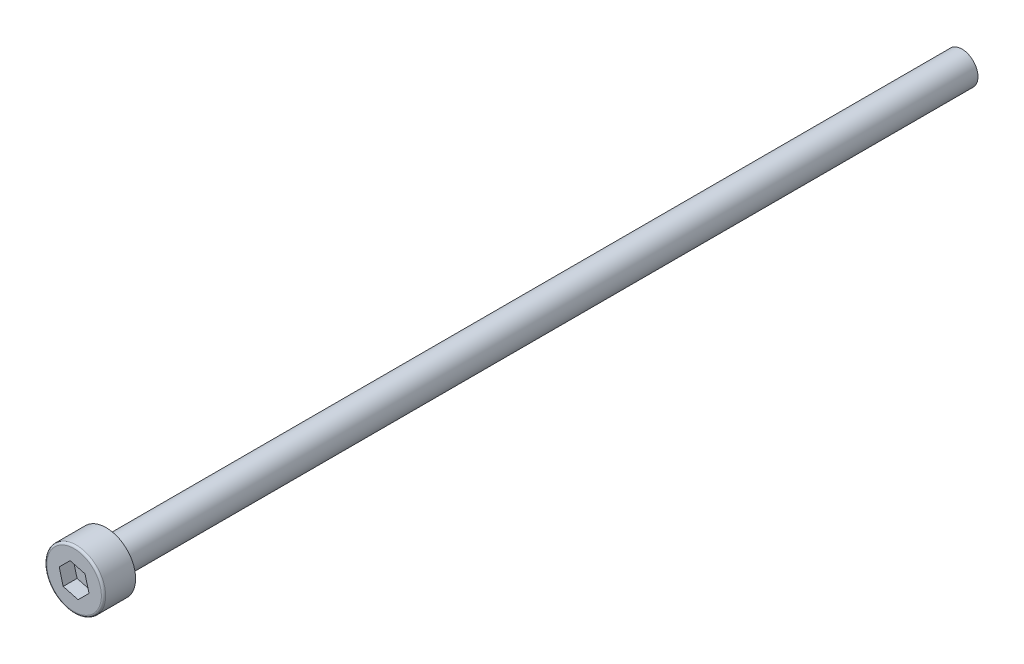
ISO-10303-21;
HEADER;
FILE_DESCRIPTION(('STEP AP214'),'2;1');
FILE_NAME('part.step','',(''),(''),'','','');
FILE_SCHEMA(('AUTOMOTIVE_DESIGN { 1 0 10303 214 1 1 1 1 }'));
ENDSEC;
DATA;
#1=APPLICATION_CONTEXT('core data for automotive mechanical design processes');
#2=APPLICATION_PROTOCOL_DEFINITION('international standard','automotive_design',2000,#1);
#3=PRODUCT_CONTEXT('',#1,'mechanical');
#4=PRODUCT('Part','Part','',(#3));
#5=PRODUCT_RELATED_PRODUCT_CATEGORY('part','',(#4));
#6=PRODUCT_DEFINITION_FORMATION('','',#4);
#7=PRODUCT_DEFINITION_CONTEXT('part definition',#1,'design');
#8=PRODUCT_DEFINITION('design','',#6,#7);
#9=PRODUCT_DEFINITION_SHAPE('','',#8);
#10=(LENGTH_UNIT() NAMED_UNIT(*) SI_UNIT(.MILLI.,.METRE.));
#11=(NAMED_UNIT(*) PLANE_ANGLE_UNIT() SI_UNIT($,.RADIAN.));
#12=(NAMED_UNIT(*) SI_UNIT($,.STERADIAN.) SOLID_ANGLE_UNIT());
#13=UNCERTAINTY_MEASURE_WITH_UNIT(LENGTH_MEASURE(1.E-05),#10,'distance_accuracy_value','');
#14=(GEOMETRIC_REPRESENTATION_CONTEXT(3) GLOBAL_UNCERTAINTY_ASSIGNED_CONTEXT((#13)) GLOBAL_UNIT_ASSIGNED_CONTEXT((#10,
#11,#12)) REPRESENTATION_CONTEXT('',''));
#15=CARTESIAN_POINT('',(0.,0.,0.));
#16=DIRECTION('',(0.,0.,1.));
#17=DIRECTION('',(1.,0.,0.));
#18=AXIS2_PLACEMENT_3D('',#15,#16,#17);
#19=CARTESIAN_POINT('',(0.,0.,0.));
#20=DIRECTION('',(0.,0.,1.));
#21=DIRECTION('',(1.,0.,0.));
#22=AXIS2_PLACEMENT_3D('',#19,#20,#21);
#23=PLANE('',#22);
#24=CARTESIAN_POINT('',(0.,0.,0.));
#25=DIRECTION('',(0.,0.,1.));
#26=DIRECTION('',(1.,0.,0.));
#27=AXIS2_PLACEMENT_3D('',#24,#25,#26);
#28=CIRCLE('',#27,2.75);
#29=CARTESIAN_POINT('',(2.75,0.,0.));
#30=VERTEX_POINT('',#29);
#31=EDGE_CURVE('E138',#30,#30,#28,.T.);
#32=ORIENTED_EDGE('',*,*,#31,.F.);
#33=EDGE_LOOP('',(#32));
#34=FACE_BOUND('',#33,.T.);
#35=CARTESIAN_POINT('',(0.,0.,0.));
#36=DIRECTION('',(0.,0.,1.));
#37=DIRECTION('',(1.,0.,0.));
#38=AXIS2_PLACEMENT_3D('',#35,#36,#37);
#39=CIRCLE('',#38,1.5);
#40=CARTESIAN_POINT('',(1.5,0.,0.));
#41=VERTEX_POINT('',#40);
#42=EDGE_CURVE('E146',#41,#41,#39,.F.);
#43=ORIENTED_EDGE('',*,*,#42,.F.);
#44=EDGE_LOOP('',(#43));
#45=FACE_BOUND('',#44,.T.);
#46=ADVANCED_FACE('F35',(#34,#45),#23,.F.);
#47=CARTESIAN_POINT('',(0.,0.,3.));
#48=DIRECTION('',(0.,0.,-1.));
#49=DIRECTION('',(-1.,0.,0.));
#50=AXIS2_PLACEMENT_3D('',#47,#48,#49);
#51=CYLINDRICAL_SURFACE('',#50,2.75);
#52=CARTESIAN_POINT('',(0.,0.,2.8));
#53=DIRECTION('',(0.,0.,1.));
#54=DIRECTION('',(1.,0.,0.));
#55=AXIS2_PLACEMENT_3D('',#52,#53,#54);
#56=CIRCLE('',#55,2.75);
#57=CARTESIAN_POINT('',(2.75,0.,2.8));
#58=VERTEX_POINT('',#57);
#59=EDGE_CURVE('E11',#58,#58,#56,.F.);
#60=ORIENTED_EDGE('',*,*,#59,.T.);
#61=EDGE_LOOP('',(#60));
#62=FACE_BOUND('',#61,.T.);
#63=ORIENTED_EDGE('',*,*,#31,.T.);
#64=EDGE_LOOP('',(#63));
#65=FACE_BOUND('',#64,.T.);
#66=ADVANCED_FACE('F165',(#62,#65),#51,.T.);
#67=CARTESIAN_POINT('',(0.,0.,3.));
#68=DIRECTION('',(0.,0.,1.));
#69=DIRECTION('',(1.,0.,0.));
#70=AXIS2_PLACEMENT_3D('',#67,#68,#69);
#71=PLANE('',#70);
#72=CARTESIAN_POINT('',(0.,0.,3.));
#73=DIRECTION('',(0.,0.,1.));
#74=DIRECTION('',(1.,0.,0.));
#75=AXIS2_PLACEMENT_3D('',#72,#73,#74);
#76=CIRCLE('',#75,2.55);
#77=CARTESIAN_POINT('',(2.55,0.,3.));
#78=VERTEX_POINT('',#77);
#79=EDGE_CURVE('E43',#78,#78,#76,.T.);
#80=ORIENTED_EDGE('',*,*,#79,.T.);
#81=EDGE_LOOP('',(#80));
#82=FACE_BOUND('',#81,.T.);
#83=DIRECTION('',(0.258819045102521,-0.965925826289068,0.));
#84=VECTOR('',#83,1.);
#85=CARTESIAN_POINT('',(-1.39419383956301,0.373573113403356,3.));
#86=LINE('',#85,#84);
#87=CARTESIAN_POINT('',(-1.39419383956301,0.373573113403356,3.));
#88=VERTEX_POINT('',#87);
#89=CARTESIAN_POINT('',(-1.02062072615966,-1.02062072615966,3.));
#90=VERTEX_POINT('',#89);
#91=EDGE_CURVE('E50',#88,#90,#86,.T.);
#92=ORIENTED_EDGE('',*,*,#91,.F.);
#93=DIRECTION('',(-0.707106781186548,-0.707106781186548,0.));
#94=VECTOR('',#93,1.);
#95=CARTESIAN_POINT('',(-0.373573113403355,1.39419383956301,3.));
#96=LINE('',#95,#94);
#97=CARTESIAN_POINT('',(-0.373573113403355,1.39419383956301,3.));
#98=VERTEX_POINT('',#97);
#99=EDGE_CURVE('E134',#98,#88,#96,.T.);
#100=ORIENTED_EDGE('',*,*,#99,.F.);
#101=DIRECTION('',(-0.965925826289068,0.258819045102521,0.));
#102=VECTOR('',#101,1.);
#103=CARTESIAN_POINT('',(1.02062072615966,1.02062072615966,3.));
#104=LINE('',#103,#102);
#105=CARTESIAN_POINT('',(1.02062072615966,1.02062072615966,3.));
#106=VERTEX_POINT('',#105);
#107=EDGE_CURVE('E132',#106,#98,#104,.T.);
#108=ORIENTED_EDGE('',*,*,#107,.F.);
#109=DIRECTION('',(-0.258819045102521,0.965925826289068,0.));
#110=VECTOR('',#109,1.);
#111=CARTESIAN_POINT('',(1.39419383956301,-0.373573113403355,3.));
#112=LINE('',#111,#110);
#113=CARTESIAN_POINT('',(1.39419383956301,-0.373573113403355,3.));
#114=VERTEX_POINT('',#113);
#115=EDGE_CURVE('E98',#114,#106,#112,.T.);
#116=ORIENTED_EDGE('',*,*,#115,.F.);
#117=DIRECTION('',(0.707106781186548,0.707106781186548,0.));
#118=VECTOR('',#117,1.);
#119=CARTESIAN_POINT('',(0.373573113403355,-1.39419383956301,3.));
#120=LINE('',#119,#118);
#121=CARTESIAN_POINT('',(0.373573113403355,-1.39419383956301,3.));
#122=VERTEX_POINT('',#121);
#123=EDGE_CURVE('E128',#122,#114,#120,.T.);
#124=ORIENTED_EDGE('',*,*,#123,.F.);
#125=DIRECTION('',(0.965925826289068,-0.258819045102521,0.));
#126=VECTOR('',#125,1.);
#127=CARTESIAN_POINT('',(-1.02062072615966,-1.02062072615966,3.));
#128=LINE('',#127,#126);
#129=EDGE_CURVE('E124',#90,#122,#128,.T.);
#130=ORIENTED_EDGE('',*,*,#129,.F.);
#131=EDGE_LOOP('',(#92,#100,#108,#116,#124,#130));
#132=FACE_BOUND('',#131,.T.);
#133=ADVANCED_FACE('F151',(#82,#132),#71,.T.);
#134=CARTESIAN_POINT('',(-1.39419383956301,0.373573113403356,1.7));
#135=DIRECTION('',(-0.965925826289068,-0.258819045102521,0.));
#136=DIRECTION('',(0.258819045102521,-0.965925826289068,0.));
#137=AXIS2_PLACEMENT_3D('',#134,#135,#136);
#138=PLANE('',#137);
#139=ORIENTED_EDGE('',*,*,#91,.T.);
#140=DIRECTION('',(0.,0.,1.));
#141=VECTOR('',#140,1.);
#142=CARTESIAN_POINT('',(-1.02062072615966,-1.02062072615966,1.7));
#143=LINE('',#142,#141);
#144=CARTESIAN_POINT('',(-1.02062072615966,-1.02062072615966,1.7));
#145=VERTEX_POINT('',#144);
#146=EDGE_CURVE('E80',#145,#90,#143,.T.);
#147=ORIENTED_EDGE('',*,*,#146,.F.);
#148=DIRECTION('',(0.258819045102521,-0.965925826289068,0.));
#149=VECTOR('',#148,1.);
#150=CARTESIAN_POINT('',(-1.39419383956301,0.373573113403356,1.7));
#151=LINE('',#150,#149);
#152=CARTESIAN_POINT('',(-1.39419383956301,0.373573113403356,1.7));
#153=VERTEX_POINT('',#152);
#154=EDGE_CURVE('E136',#153,#145,#151,.T.);
#155=ORIENTED_EDGE('',*,*,#154,.F.);
#156=DIRECTION('',(0.,0.,1.));
#157=VECTOR('',#156,1.);
#158=CARTESIAN_POINT('',(-1.39419383956301,0.373573113403356,1.7));
#159=LINE('',#158,#157);
#160=EDGE_CURVE('E58',#153,#88,#159,.T.);
#161=ORIENTED_EDGE('',*,*,#160,.T.);
#162=EDGE_LOOP('',(#139,#147,#155,#161));
#163=FACE_BOUND('',#162,.T.);
#164=ADVANCED_FACE('F177',(#163),#138,.F.);
#165=CARTESIAN_POINT('',(-0.373573113403355,1.39419383956301,1.7));
#166=DIRECTION('',(-0.707106781186548,0.707106781186548,0.));
#167=DIRECTION('',(-0.707106781186548,-0.707106781186548,0.));
#168=AXIS2_PLACEMENT_3D('',#165,#166,#167);
#169=PLANE('',#168);
#170=ORIENTED_EDGE('',*,*,#99,.T.);
#171=ORIENTED_EDGE('',*,*,#160,.F.);
#172=DIRECTION('',(-0.707106781186548,-0.707106781186548,0.));
#173=VECTOR('',#172,1.);
#174=CARTESIAN_POINT('',(-0.373573113403355,1.39419383956301,1.7));
#175=LINE('',#174,#173);
#176=CARTESIAN_POINT('',(-0.373573113403355,1.39419383956301,1.7));
#177=VERTEX_POINT('',#176);
#178=EDGE_CURVE('E110',#177,#153,#175,.T.);
#179=ORIENTED_EDGE('',*,*,#178,.F.);
#180=DIRECTION('',(0.,0.,1.));
#181=VECTOR('',#180,1.);
#182=CARTESIAN_POINT('',(-0.373573113403355,1.39419383956301,1.7));
#183=LINE('',#182,#181);
#184=EDGE_CURVE('E102',#177,#98,#183,.T.);
#185=ORIENTED_EDGE('',*,*,#184,.T.);
#186=EDGE_LOOP('',(#170,#171,#179,#185));
#187=FACE_BOUND('',#186,.T.);
#188=ADVANCED_FACE('F180',(#187),#169,.F.);
#189=CARTESIAN_POINT('',(1.02062072615966,1.02062072615966,1.7));
#190=DIRECTION('',(0.258819045102521,0.965925826289068,0.));
#191=DIRECTION('',(-0.965925826289068,0.258819045102521,0.));
#192=AXIS2_PLACEMENT_3D('',#189,#190,#191);
#193=PLANE('',#192);
#194=ORIENTED_EDGE('',*,*,#107,.T.);
#195=ORIENTED_EDGE('',*,*,#184,.F.);
#196=DIRECTION('',(-0.965925826289068,0.258819045102521,0.));
#197=VECTOR('',#196,1.);
#198=CARTESIAN_POINT('',(1.02062072615966,1.02062072615966,1.7));
#199=LINE('',#198,#197);
#200=CARTESIAN_POINT('',(1.02062072615966,1.02062072615966,1.7));
#201=VERTEX_POINT('',#200);
#202=EDGE_CURVE('E106',#201,#177,#199,.T.);
#203=ORIENTED_EDGE('',*,*,#202,.F.);
#204=DIRECTION('',(0.,0.,1.));
#205=VECTOR('',#204,1.);
#206=CARTESIAN_POINT('',(1.02062072615966,1.02062072615966,1.7));
#207=LINE('',#206,#205);
#208=EDGE_CURVE('E91',#201,#106,#207,.T.);
#209=ORIENTED_EDGE('',*,*,#208,.T.);
#210=EDGE_LOOP('',(#194,#195,#203,#209));
#211=FACE_BOUND('',#210,.T.);
#212=ADVANCED_FACE('F107',(#211),#193,.F.);
#213=CARTESIAN_POINT('',(1.39419383956301,-0.373573113403355,1.7));
#214=DIRECTION('',(0.965925826289068,0.258819045102521,0.));
#215=DIRECTION('',(-0.258819045102521,0.965925826289068,0.));
#216=AXIS2_PLACEMENT_3D('',#213,#214,#215);
#217=PLANE('',#216);
#218=ORIENTED_EDGE('',*,*,#115,.T.);
#219=ORIENTED_EDGE('',*,*,#208,.F.);
#220=DIRECTION('',(-0.258819045102521,0.965925826289068,0.));
#221=VECTOR('',#220,1.);
#222=CARTESIAN_POINT('',(1.39419383956301,-0.373573113403355,1.7));
#223=LINE('',#222,#221);
#224=CARTESIAN_POINT('',(1.39419383956301,-0.373573113403355,1.7));
#225=VERTEX_POINT('',#224);
#226=EDGE_CURVE('E95',#225,#201,#223,.T.);
#227=ORIENTED_EDGE('',*,*,#226,.F.);
#228=DIRECTION('',(0.,0.,1.));
#229=VECTOR('',#228,1.);
#230=CARTESIAN_POINT('',(1.39419383956301,-0.373573113403355,1.7));
#231=LINE('',#230,#229);
#232=EDGE_CURVE('E103',#225,#114,#231,.T.);
#233=ORIENTED_EDGE('',*,*,#232,.T.);
#234=EDGE_LOOP('',(#218,#219,#227,#233));
#235=FACE_BOUND('',#234,.T.);
#236=ADVANCED_FACE('F93',(#235),#217,.F.);
#237=CARTESIAN_POINT('',(0.373573113403355,-1.39419383956301,1.7));
#238=DIRECTION('',(0.707106781186548,-0.707106781186548,0.));
#239=DIRECTION('',(0.707106781186548,0.707106781186548,0.));
#240=AXIS2_PLACEMENT_3D('',#237,#238,#239);
#241=PLANE('',#240);
#242=ORIENTED_EDGE('',*,*,#123,.T.);
#243=ORIENTED_EDGE('',*,*,#232,.F.);
#244=DIRECTION('',(0.707106781186548,0.707106781186548,0.));
#245=VECTOR('',#244,1.);
#246=CARTESIAN_POINT('',(0.373573113403355,-1.39419383956301,1.7));
#247=LINE('',#246,#245);
#248=CARTESIAN_POINT('',(0.373573113403355,-1.39419383956301,1.7));
#249=VERTEX_POINT('',#248);
#250=EDGE_CURVE('E116',#249,#225,#247,.T.);
#251=ORIENTED_EDGE('',*,*,#250,.F.);
#252=DIRECTION('',(0.,0.,1.));
#253=VECTOR('',#252,1.);
#254=CARTESIAN_POINT('',(0.373573113403355,-1.39419383956301,1.7));
#255=LINE('',#254,#253);
#256=EDGE_CURVE('E141',#249,#122,#255,.T.);
#257=ORIENTED_EDGE('',*,*,#256,.T.);
#258=EDGE_LOOP('',(#242,#243,#251,#257));
#259=FACE_BOUND('',#258,.T.);
#260=ADVANCED_FACE('F184',(#259),#241,.F.);
#261=CARTESIAN_POINT('',(-1.02062072615966,-1.02062072615966,1.7));
#262=DIRECTION('',(-0.258819045102521,-0.965925826289068,0.));
#263=DIRECTION('',(0.965925826289068,-0.258819045102521,0.));
#264=AXIS2_PLACEMENT_3D('',#261,#262,#263);
#265=PLANE('',#264);
#266=ORIENTED_EDGE('',*,*,#129,.T.);
#267=ORIENTED_EDGE('',*,*,#256,.F.);
#268=DIRECTION('',(0.965925826289068,-0.258819045102521,0.));
#269=VECTOR('',#268,1.);
#270=CARTESIAN_POINT('',(-1.02062072615966,-1.02062072615966,1.7));
#271=LINE('',#270,#269);
#272=EDGE_CURVE('E118',#145,#249,#271,.T.);
#273=ORIENTED_EDGE('',*,*,#272,.F.);
#274=ORIENTED_EDGE('',*,*,#146,.T.);
#275=EDGE_LOOP('',(#266,#267,#273,#274));
#276=FACE_BOUND('',#275,.T.);
#277=ADVANCED_FACE('F181',(#276),#265,.F.);
#278=CARTESIAN_POINT('',(0.,0.,1.7));
#279=DIRECTION('',(0.,0.,1.));
#280=DIRECTION('',(1.,0.,0.));
#281=AXIS2_PLACEMENT_3D('',#278,#279,#280);
#282=PLANE('',#281);
#283=ORIENTED_EDGE('',*,*,#154,.T.);
#284=ORIENTED_EDGE('',*,*,#272,.T.);
#285=ORIENTED_EDGE('',*,*,#250,.T.);
#286=ORIENTED_EDGE('',*,*,#226,.T.);
#287=ORIENTED_EDGE('',*,*,#202,.T.);
#288=ORIENTED_EDGE('',*,*,#178,.T.);
#289=EDGE_LOOP('',(#283,#284,#285,#286,#287,#288));
#290=FACE_BOUND('',#289,.T.);
#291=ADVANCED_FACE('F113',(#290),#282,.T.);
#292=CARTESIAN_POINT('',(0.,0.,-80.));
#293=DIRECTION('',(0.,0.,1.));
#294=DIRECTION('',(1.,0.,0.));
#295=AXIS2_PLACEMENT_3D('',#292,#293,#294);
#296=CYLINDRICAL_SURFACE('',#295,1.5);
#297=CARTESIAN_POINT('',(0.,0.,-80.));
#298=DIRECTION('',(0.,0.,-1.));
#299=DIRECTION('',(-1.,0.,0.));
#300=AXIS2_PLACEMENT_3D('',#297,#298,#299);
#301=CIRCLE('',#300,1.5);
#302=CARTESIAN_POINT('',(-1.5,0.,-80.));
#303=VERTEX_POINT('',#302);
#304=EDGE_CURVE('E125',#303,#303,#301,.T.);
#305=ORIENTED_EDGE('',*,*,#304,.F.);
#306=EDGE_LOOP('',(#305));
#307=FACE_BOUND('',#306,.T.);
#308=ORIENTED_EDGE('',*,*,#42,.T.);
#309=EDGE_LOOP('',(#308));
#310=FACE_BOUND('',#309,.T.);
#311=ADVANCED_FACE('F160',(#307,#310),#296,.T.);
#312=CARTESIAN_POINT('',(0.,0.,-80.));
#313=DIRECTION('',(0.,0.,-1.));
#314=DIRECTION('',(-1.,0.,0.));
#315=AXIS2_PLACEMENT_3D('',#312,#313,#314);
#316=PLANE('',#315);
#317=ORIENTED_EDGE('',*,*,#304,.T.);
#318=EDGE_LOOP('',(#317));
#319=FACE_BOUND('',#318,.T.);
#320=ADVANCED_FACE('F155',(#319),#316,.T.);
#321=CARTESIAN_POINT('',(0.,0.,2.8));
#322=DIRECTION('',(0.,0.,1.));
#323=DIRECTION('',(1.,0.,0.));
#324=AXIS2_PLACEMENT_3D('',#321,#322,#323);
#325=TOROIDAL_SURFACE('',#324,2.55,0.2);
#326=ORIENTED_EDGE('',*,*,#59,.F.);
#327=EDGE_LOOP('',(#326));
#328=FACE_BOUND('',#327,.T.);
#329=ORIENTED_EDGE('',*,*,#79,.F.);
#330=EDGE_LOOP('',(#329));
#331=FACE_BOUND('',#330,.T.);
#332=ADVANCED_FACE('F37',(#328,#331),#325,.T.);
#333=CLOSED_SHELL('',(#46,#66,#133,#164,#188,#212,#236,#260,#277,#291,#311,#320,#332));
#334=MANIFOLD_SOLID_BREP('B2',#333);
#335=ADVANCED_BREP_SHAPE_REPRESENTATION('',(#18,#334),#14);
#336=SHAPE_DEFINITION_REPRESENTATION(#9,#335);
ENDSEC;
END-ISO-10303-21;
